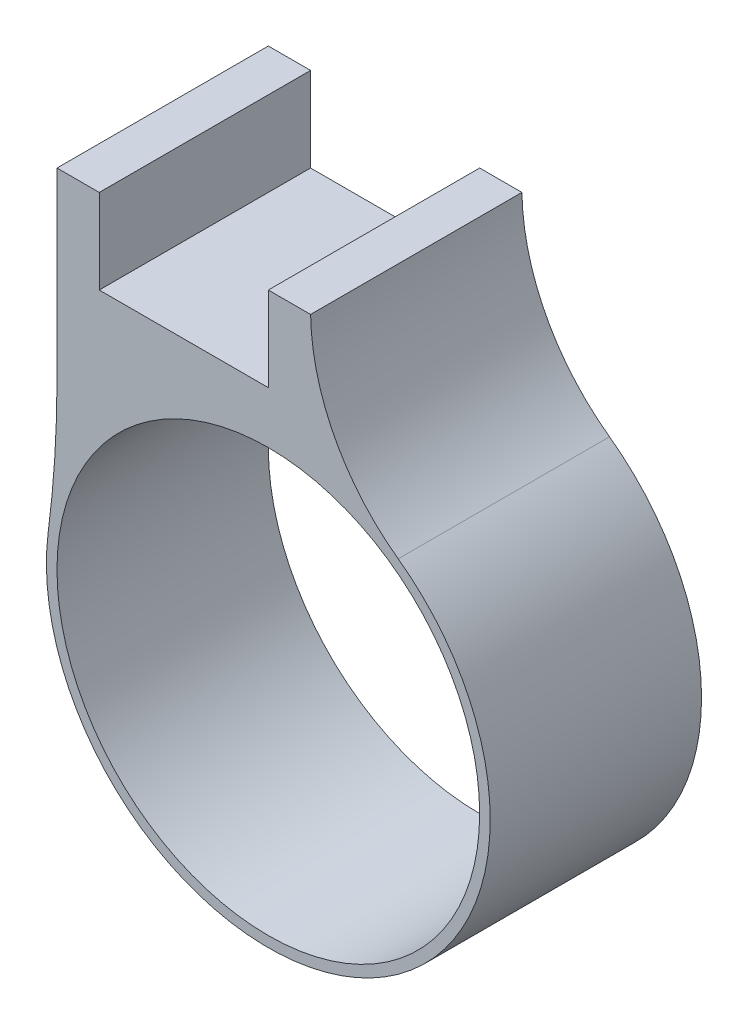
ISO-10303-21;
HEADER;
FILE_DESCRIPTION(('STEP AP214'),'2;1');
FILE_NAME('part.step','',(''),(''),'','','');
FILE_SCHEMA(('AUTOMOTIVE_DESIGN { 1 0 10303 214 1 1 1 1 }'));
ENDSEC;
DATA;
#1=APPLICATION_CONTEXT('core data for automotive mechanical design processes');
#2=APPLICATION_PROTOCOL_DEFINITION('international standard','automotive_design',2000,#1);
#3=PRODUCT_CONTEXT('',#1,'mechanical');
#4=PRODUCT('Part','Part','',(#3));
#5=PRODUCT_RELATED_PRODUCT_CATEGORY('part','',(#4));
#6=PRODUCT_DEFINITION_FORMATION('','',#4);
#7=PRODUCT_DEFINITION_CONTEXT('part definition',#1,'design');
#8=PRODUCT_DEFINITION('design','',#6,#7);
#9=PRODUCT_DEFINITION_SHAPE('','',#8);
#10=(LENGTH_UNIT() NAMED_UNIT(*) SI_UNIT(.MILLI.,.METRE.));
#11=(NAMED_UNIT(*) PLANE_ANGLE_UNIT() SI_UNIT($,.RADIAN.));
#12=(NAMED_UNIT(*) SI_UNIT($,.STERADIAN.) SOLID_ANGLE_UNIT());
#13=UNCERTAINTY_MEASURE_WITH_UNIT(LENGTH_MEASURE(1.E-05),#10,'distance_accuracy_value','');
#14=(GEOMETRIC_REPRESENTATION_CONTEXT(3) GLOBAL_UNCERTAINTY_ASSIGNED_CONTEXT((#13)) GLOBAL_UNIT_ASSIGNED_CONTEXT((#10,
#11,#12)) REPRESENTATION_CONTEXT('',''));
#15=CARTESIAN_POINT('',(0.,0.,0.));
#16=DIRECTION('',(0.,0.,1.));
#17=DIRECTION('',(1.,0.,0.));
#18=AXIS2_PLACEMENT_3D('',#15,#16,#17);
#19=CARTESIAN_POINT('',(-10.,0.,10.));
#20=DIRECTION('',(1.,0.,0.));
#21=DIRECTION('',(0.,1.,0.));
#22=AXIS2_PLACEMENT_3D('',#19,#20,#21);
#23=PLANE('',#22);
#24=DIRECTION('',(0.,-1.,0.));
#25=VECTOR('',#24,1.);
#26=CARTESIAN_POINT('',(-10.,0.,0.));
#27=LINE('',#26,#25);
#28=CARTESIAN_POINT('',(-10.,16.4554488157616,0.));
#29=VERTEX_POINT('',#28);
#30=CARTESIAN_POINT('',(-10.,7.76208734813007,0.));
#31=VERTEX_POINT('',#30);
#32=EDGE_CURVE('E153',#29,#31,#27,.T.);
#33=ORIENTED_EDGE('',*,*,#32,.T.);
#34=DIRECTION('',(0.,0.,1.));
#35=VECTOR('',#34,1.);
#36=CARTESIAN_POINT('',(-9.99999999999999,7.76208734813007,10.));
#37=LINE('',#36,#35);
#38=CARTESIAN_POINT('',(-10.,7.76208734813007,10.));
#39=VERTEX_POINT('',#38);
#40=EDGE_CURVE('E127',#31,#39,#37,.T.);
#41=ORIENTED_EDGE('',*,*,#40,.T.);
#42=DIRECTION('',(0.,-1.,0.));
#43=VECTOR('',#42,1.);
#44=CARTESIAN_POINT('',(-10.,0.,10.));
#45=LINE('',#44,#43);
#46=CARTESIAN_POINT('',(-10.,16.4554488157616,10.));
#47=VERTEX_POINT('',#46);
#48=EDGE_CURVE('E141',#47,#39,#45,.T.);
#49=ORIENTED_EDGE('',*,*,#48,.F.);
#50=DIRECTION('',(0.,0.,-1.));
#51=VECTOR('',#50,1.);
#52=CARTESIAN_POINT('',(-10.,16.4554488157616,10.));
#53=LINE('',#52,#51);
#54=EDGE_CURVE('E157',#47,#29,#53,.T.);
#55=ORIENTED_EDGE('',*,*,#54,.T.);
#56=EDGE_LOOP('',(#33,#41,#49,#55));
#57=FACE_BOUND('',#56,.T.);
#58=ADVANCED_FACE('F36',(#57),#23,.F.);
#59=CARTESIAN_POINT('',(0.,0.,10.));
#60=DIRECTION('',(0.,0.,-1.));
#61=DIRECTION('',(-1.,0.,0.));
#62=AXIS2_PLACEMENT_3D('',#59,#60,#61);
#63=CYLINDRICAL_SURFACE('',#62,10.5);
#64=CARTESIAN_POINT('',(0.,0.,0.));
#65=DIRECTION('',(0.,0.,1.));
#66=DIRECTION('',(1.,0.,0.));
#67=AXIS2_PLACEMENT_3D('',#64,#65,#66);
#68=CIRCLE('',#67,10.5);
#69=CARTESIAN_POINT('',(-10.4132231404959,1.34713912653497,0.));
#70=VERTEX_POINT('',#69);
#71=CARTESIAN_POINT('',(6.14563298944859,8.51358885306315,0.));
#72=VERTEX_POINT('',#71);
#73=EDGE_CURVE('E155',#70,#72,#68,.T.);
#74=ORIENTED_EDGE('',*,*,#73,.T.);
#75=DIRECTION('',(0.,0.,-1.));
#76=VECTOR('',#75,1.);
#77=CARTESIAN_POINT('',(6.14563298944859,8.51358885306315,10.));
#78=LINE('',#77,#76);
#79=CARTESIAN_POINT('',(6.14563298944859,8.51358885306315,10.));
#80=VERTEX_POINT('',#79);
#81=EDGE_CURVE('E57',#72,#80,#78,.F.);
#82=ORIENTED_EDGE('',*,*,#81,.T.);
#83=CARTESIAN_POINT('',(0.,0.,10.));
#84=DIRECTION('',(0.,0.,1.));
#85=DIRECTION('',(1.,0.,0.));
#86=AXIS2_PLACEMENT_3D('',#83,#84,#85);
#87=CIRCLE('',#86,10.5);
#88=CARTESIAN_POINT('',(-10.4132231404959,1.34713912653497,10.));
#89=VERTEX_POINT('',#88);
#90=EDGE_CURVE('E112',#89,#80,#87,.T.);
#91=ORIENTED_EDGE('',*,*,#90,.F.);
#92=DIRECTION('',(0.,0.,-1.));
#93=VECTOR('',#92,1.);
#94=CARTESIAN_POINT('',(-10.4132231404959,1.34713912653497,10.));
#95=LINE('',#94,#93);
#96=EDGE_CURVE('E124',#89,#70,#95,.T.);
#97=ORIENTED_EDGE('',*,*,#96,.T.);
#98=EDGE_LOOP('',(#74,#82,#91,#97));
#99=FACE_BOUND('',#98,.T.);
#100=ADVANCED_FACE('F145',(#99),#63,.T.);
#101=CARTESIAN_POINT('',(0.,16.4554488157616,10.));
#102=DIRECTION('',(0.,1.,0.));
#103=DIRECTION('',(-1.,0.,0.));
#104=AXIS2_PLACEMENT_3D('',#101,#102,#103);
#105=PLANE('',#104);
#106=DIRECTION('',(1.,0.,0.));
#107=VECTOR('',#106,1.);
#108=CARTESIAN_POINT('',(0.,16.4554488157616,0.));
#109=LINE('',#108,#107);
#110=CARTESIAN_POINT('',(0.,16.4554488157616,0.));
#111=VERTEX_POINT('',#110);
#112=CARTESIAN_POINT('',(2.,16.4554488157616,0.));
#113=VERTEX_POINT('',#112);
#114=EDGE_CURVE('E159',#111,#113,#109,.T.);
#115=ORIENTED_EDGE('',*,*,#114,.F.);
#116=DIRECTION('',(0.,0.,-1.));
#117=VECTOR('',#116,1.);
#118=CARTESIAN_POINT('',(0.,16.4554488157616,10.));
#119=LINE('',#118,#117);
#120=CARTESIAN_POINT('',(0.,16.4554488157616,10.));
#121=VERTEX_POINT('',#120);
#122=EDGE_CURVE('E120',#121,#111,#119,.T.);
#123=ORIENTED_EDGE('',*,*,#122,.F.);
#124=DIRECTION('',(1.,0.,0.));
#125=VECTOR('',#124,1.);
#126=CARTESIAN_POINT('',(0.,16.4554488157616,10.));
#127=LINE('',#126,#125);
#128=CARTESIAN_POINT('',(2.,16.4554488157616,10.));
#129=VERTEX_POINT('',#128);
#130=EDGE_CURVE('E111',#121,#129,#127,.T.);
#131=ORIENTED_EDGE('',*,*,#130,.T.);
#132=DIRECTION('',(0.,0.,-1.));
#133=VECTOR('',#132,1.);
#134=CARTESIAN_POINT('',(2.,16.4554488157616,10.));
#135=LINE('',#134,#133);
#136=EDGE_CURVE('E119',#129,#113,#135,.T.);
#137=ORIENTED_EDGE('',*,*,#136,.T.);
#138=EDGE_LOOP('',(#115,#123,#131,#137));
#139=FACE_BOUND('',#138,.T.);
#140=ADVANCED_FACE('F118',(#139),#105,.T.);
#141=CARTESIAN_POINT('',(0.,0.,10.));
#142=DIRECTION('',(1.,0.,0.));
#143=DIRECTION('',(0.,1.,0.));
#144=AXIS2_PLACEMENT_3D('',#141,#142,#143);
#145=PLANE('',#144);
#146=DIRECTION('',(0.,-1.,0.));
#147=VECTOR('',#146,1.);
#148=CARTESIAN_POINT('',(0.,0.,0.));
#149=LINE('',#148,#147);
#150=CARTESIAN_POINT('',(0.,12.4554488157616,0.));
#151=VERTEX_POINT('',#150);
#152=EDGE_CURVE('E166',#111,#151,#149,.T.);
#153=ORIENTED_EDGE('',*,*,#152,.T.);
#154=DIRECTION('',(0.,0.,-1.));
#155=VECTOR('',#154,1.);
#156=CARTESIAN_POINT('',(0.,12.4554488157616,10.));
#157=LINE('',#156,#155);
#158=CARTESIAN_POINT('',(0.,12.4554488157616,10.));
#159=VERTEX_POINT('',#158);
#160=EDGE_CURVE('E129',#159,#151,#157,.T.);
#161=ORIENTED_EDGE('',*,*,#160,.F.);
#162=DIRECTION('',(0.,-1.,0.));
#163=VECTOR('',#162,1.);
#164=CARTESIAN_POINT('',(0.,0.,10.));
#165=LINE('',#164,#163);
#166=EDGE_CURVE('E122',#121,#159,#165,.T.);
#167=ORIENTED_EDGE('',*,*,#166,.F.);
#168=ORIENTED_EDGE('',*,*,#122,.T.);
#169=EDGE_LOOP('',(#153,#161,#167,#168));
#170=FACE_BOUND('',#169,.T.);
#171=ADVANCED_FACE('F205',(#170),#145,.F.);
#172=CARTESIAN_POINT('',(0.,12.4554488157616,10.));
#173=DIRECTION('',(0.,-1.,0.));
#174=DIRECTION('',(1.,0.,0.));
#175=AXIS2_PLACEMENT_3D('',#172,#173,#174);
#176=PLANE('',#175);
#177=DIRECTION('',(-1.,0.,0.));
#178=VECTOR('',#177,1.);
#179=CARTESIAN_POINT('',(0.,12.4554488157616,0.));
#180=LINE('',#179,#178);
#181=CARTESIAN_POINT('',(-8.,12.4554488157616,0.));
#182=VERTEX_POINT('',#181);
#183=EDGE_CURVE('E168',#151,#182,#180,.T.);
#184=ORIENTED_EDGE('',*,*,#183,.T.);
#185=DIRECTION('',(0.,0.,-1.));
#186=VECTOR('',#185,1.);
#187=CARTESIAN_POINT('',(-8.,12.4554488157616,10.));
#188=LINE('',#187,#186);
#189=CARTESIAN_POINT('',(-8.,12.4554488157616,10.));
#190=VERTEX_POINT('',#189);
#191=EDGE_CURVE('E182',#190,#182,#188,.T.);
#192=ORIENTED_EDGE('',*,*,#191,.F.);
#193=DIRECTION('',(-1.,0.,0.));
#194=VECTOR('',#193,1.);
#195=CARTESIAN_POINT('',(0.,12.4554488157616,10.));
#196=LINE('',#195,#194);
#197=EDGE_CURVE('E190',#159,#190,#196,.T.);
#198=ORIENTED_EDGE('',*,*,#197,.F.);
#199=ORIENTED_EDGE('',*,*,#160,.T.);
#200=EDGE_LOOP('',(#184,#192,#198,#199));
#201=FACE_BOUND('',#200,.T.);
#202=ADVANCED_FACE('F188',(#201),#176,.F.);
#203=CARTESIAN_POINT('',(-8.,0.,10.));
#204=DIRECTION('',(1.,0.,0.));
#205=DIRECTION('',(0.,0.,-1.));
#206=AXIS2_PLACEMENT_3D('',#203,#204,#205);
#207=PLANE('',#206);
#208=DIRECTION('',(0.,-1.,0.));
#209=VECTOR('',#208,1.);
#210=CARTESIAN_POINT('',(-8.,0.,0.));
#211=LINE('',#210,#209);
#212=CARTESIAN_POINT('',(-8.,16.4554488157616,0.));
#213=VERTEX_POINT('',#212);
#214=EDGE_CURVE('E171',#213,#182,#211,.T.);
#215=ORIENTED_EDGE('',*,*,#214,.F.);
#216=DIRECTION('',(0.,0.,-1.));
#217=VECTOR('',#216,1.);
#218=CARTESIAN_POINT('',(-8.,16.4554488157616,10.));
#219=LINE('',#218,#217);
#220=CARTESIAN_POINT('',(-8.,16.4554488157616,10.));
#221=VERTEX_POINT('',#220);
#222=EDGE_CURVE('E180',#221,#213,#219,.T.);
#223=ORIENTED_EDGE('',*,*,#222,.F.);
#224=DIRECTION('',(0.,-1.,0.));
#225=VECTOR('',#224,1.);
#226=CARTESIAN_POINT('',(-8.,0.,10.));
#227=LINE('',#226,#225);
#228=EDGE_CURVE('E198',#221,#190,#227,.T.);
#229=ORIENTED_EDGE('',*,*,#228,.T.);
#230=ORIENTED_EDGE('',*,*,#191,.T.);
#231=EDGE_LOOP('',(#215,#223,#229,#230));
#232=FACE_BOUND('',#231,.T.);
#233=ADVANCED_FACE('F195',(#232),#207,.T.);
#234=CARTESIAN_POINT('',(0.,16.4554488157616,10.));
#235=DIRECTION('',(0.,1.,0.));
#236=DIRECTION('',(0.,0.,1.));
#237=AXIS2_PLACEMENT_3D('',#234,#235,#236);
#238=PLANE('',#237);
#239=DIRECTION('',(1.,0.,0.));
#240=VECTOR('',#239,1.);
#241=CARTESIAN_POINT('',(0.,16.4554488157616,0.));
#242=LINE('',#241,#240);
#243=EDGE_CURVE('E174',#29,#213,#242,.T.);
#244=ORIENTED_EDGE('',*,*,#243,.F.);
#245=ORIENTED_EDGE('',*,*,#54,.F.);
#246=DIRECTION('',(1.,0.,0.));
#247=VECTOR('',#246,1.);
#248=CARTESIAN_POINT('',(0.,16.4554488157616,10.));
#249=LINE('',#248,#247);
#250=EDGE_CURVE('E200',#47,#221,#249,.T.);
#251=ORIENTED_EDGE('',*,*,#250,.T.);
#252=ORIENTED_EDGE('',*,*,#222,.T.);
#253=EDGE_LOOP('',(#244,#245,#251,#252));
#254=FACE_BOUND('',#253,.T.);
#255=ADVANCED_FACE('F234',(#254),#238,.T.);
#256=CARTESIAN_POINT('',(0.,0.,10.));
#257=DIRECTION('',(0.,0.,-1.));
#258=DIRECTION('',(-1.,0.,0.));
#259=AXIS2_PLACEMENT_3D('',#256,#257,#258);
#260=CYLINDRICAL_SURFACE('',#259,10.);
#261=CARTESIAN_POINT('',(0.,0.,10.));
#262=DIRECTION('',(0.,0.,1.));
#263=DIRECTION('',(1.,0.,0.));
#264=AXIS2_PLACEMENT_3D('',#261,#262,#263);
#265=CIRCLE('',#264,10.);
#266=CARTESIAN_POINT('',(10.,0.,10.));
#267=VERTEX_POINT('',#266);
#268=EDGE_CURVE('E162',#267,#267,#265,.T.);
#269=ORIENTED_EDGE('',*,*,#268,.T.);
#270=EDGE_LOOP('',(#269));
#271=FACE_BOUND('',#270,.T.);
#272=CARTESIAN_POINT('',(0.,0.,0.));
#273=DIRECTION('',(0.,0.,1.));
#274=DIRECTION('',(1.,0.,0.));
#275=AXIS2_PLACEMENT_3D('',#272,#273,#274);
#276=CIRCLE('',#275,10.);
#277=CARTESIAN_POINT('',(10.,0.,0.));
#278=VERTEX_POINT('',#277);
#279=EDGE_CURVE('E176',#278,#278,#276,.T.);
#280=ORIENTED_EDGE('',*,*,#279,.F.);
#281=EDGE_LOOP('',(#280));
#282=FACE_BOUND('',#281,.T.);
#283=ADVANCED_FACE('F229',(#271,#282),#260,.F.);
#284=CARTESIAN_POINT('',(0.,0.,10.));
#285=DIRECTION('',(0.,0.,1.));
#286=DIRECTION('',(1.,0.,0.));
#287=AXIS2_PLACEMENT_3D('',#284,#285,#286);
#288=PLANE('',#287);
#289=ORIENTED_EDGE('',*,*,#48,.T.);
#290=CARTESIAN_POINT('',(-60.,7.76208734813006,10.));
#291=DIRECTION('',(0.,0.,1.));
#292=DIRECTION('',(1.,0.,0.));
#293=AXIS2_PLACEMENT_3D('',#290,#291,#292);
#294=CIRCLE('',#293,50.);
#295=EDGE_CURVE('E136',#39,#89,#294,.F.);
#296=ORIENTED_EDGE('',*,*,#295,.T.);
#297=ORIENTED_EDGE('',*,*,#90,.T.);
#298=CARTESIAN_POINT('',(11.9986167889234,16.6217687131233,10.));
#299=DIRECTION('',(0.,0.,1.));
#300=DIRECTION('',(1.,0.,0.));
#301=AXIS2_PLACEMENT_3D('',#298,#299,#300);
#302=CIRCLE('',#301,10.);
#303=EDGE_CURVE('E11',#80,#129,#302,.F.);
#304=ORIENTED_EDGE('',*,*,#303,.T.);
#305=ORIENTED_EDGE('',*,*,#130,.F.);
#306=ORIENTED_EDGE('',*,*,#166,.T.);
#307=ORIENTED_EDGE('',*,*,#197,.T.);
#308=ORIENTED_EDGE('',*,*,#228,.F.);
#309=ORIENTED_EDGE('',*,*,#250,.F.);
#310=EDGE_LOOP('',(#289,#296,#297,#304,#305,#306,#307,#308,#309));
#311=FACE_BOUND('',#310,.T.);
#312=ORIENTED_EDGE('',*,*,#268,.F.);
#313=EDGE_LOOP('',(#312));
#314=FACE_BOUND('',#313,.T.);
#315=ADVANCED_FACE('F109',(#311,#314),#288,.T.);
#316=CARTESIAN_POINT('',(0.,0.,0.));
#317=DIRECTION('',(0.,0.,1.));
#318=DIRECTION('',(1.,0.,0.));
#319=AXIS2_PLACEMENT_3D('',#316,#317,#318);
#320=PLANE('',#319);
#321=ORIENTED_EDGE('',*,*,#32,.F.);
#322=ORIENTED_EDGE('',*,*,#243,.T.);
#323=ORIENTED_EDGE('',*,*,#214,.T.);
#324=ORIENTED_EDGE('',*,*,#183,.F.);
#325=ORIENTED_EDGE('',*,*,#152,.F.);
#326=ORIENTED_EDGE('',*,*,#114,.T.);
#327=CARTESIAN_POINT('',(11.9986167889234,16.6217687131233,0.));
#328=DIRECTION('',(0.,0.,1.));
#329=DIRECTION('',(1.,0.,0.));
#330=AXIS2_PLACEMENT_3D('',#327,#328,#329);
#331=CIRCLE('',#330,10.);
#332=EDGE_CURVE('E44',#113,#72,#331,.T.);
#333=ORIENTED_EDGE('',*,*,#332,.T.);
#334=ORIENTED_EDGE('',*,*,#73,.F.);
#335=CARTESIAN_POINT('',(-60.,7.76208734813006,0.));
#336=DIRECTION('',(0.,0.,1.));
#337=DIRECTION('',(1.,0.,0.));
#338=AXIS2_PLACEMENT_3D('',#335,#336,#337);
#339=CIRCLE('',#338,50.);
#340=EDGE_CURVE('E134',#70,#31,#339,.T.);
#341=ORIENTED_EDGE('',*,*,#340,.T.);
#342=EDGE_LOOP('',(#321,#322,#323,#324,#325,#326,#333,#334,#341));
#343=FACE_BOUND('',#342,.T.);
#344=ORIENTED_EDGE('',*,*,#279,.T.);
#345=EDGE_LOOP('',(#344));
#346=FACE_BOUND('',#345,.T.);
#347=ADVANCED_FACE('F150',(#343,#346),#320,.F.);
#348=CARTESIAN_POINT('',(-60.,7.76208734813006,10.));
#349=DIRECTION('',(0.,0.,-1.));
#350=DIRECTION('',(-1.,0.,0.));
#351=AXIS2_PLACEMENT_3D('',#348,#349,#350);
#352=CYLINDRICAL_SURFACE('',#351,50.);
#353=ORIENTED_EDGE('',*,*,#295,.F.);
#354=ORIENTED_EDGE('',*,*,#40,.F.);
#355=ORIENTED_EDGE('',*,*,#340,.F.);
#356=ORIENTED_EDGE('',*,*,#96,.F.);
#357=EDGE_LOOP('',(#353,#354,#355,#356));
#358=FACE_BOUND('',#357,.T.);
#359=ADVANCED_FACE('F147',(#358),#352,.F.);
#360=CARTESIAN_POINT('',(11.9986167889234,16.6217687131233,10.));
#361=DIRECTION('',(0.,0.,1.));
#362=DIRECTION('',(1.,0.,0.));
#363=AXIS2_PLACEMENT_3D('',#360,#361,#362);
#364=CYLINDRICAL_SURFACE('',#363,10.);
#365=ORIENTED_EDGE('',*,*,#303,.F.);
#366=ORIENTED_EDGE('',*,*,#81,.F.);
#367=ORIENTED_EDGE('',*,*,#332,.F.);
#368=ORIENTED_EDGE('',*,*,#136,.F.);
#369=EDGE_LOOP('',(#365,#366,#367,#368));
#370=FACE_BOUND('',#369,.T.);
#371=ADVANCED_FACE('F38',(#370),#364,.F.);
#372=CLOSED_SHELL('',(#58,#100,#140,#171,#202,#233,#255,#283,#315,#347,#359,#371));
#373=MANIFOLD_SOLID_BREP('B2',#372);
#374=ADVANCED_BREP_SHAPE_REPRESENTATION('',(#18,#373),#14);
#375=SHAPE_DEFINITION_REPRESENTATION(#9,#374);
ENDSEC;
END-ISO-10303-21;
